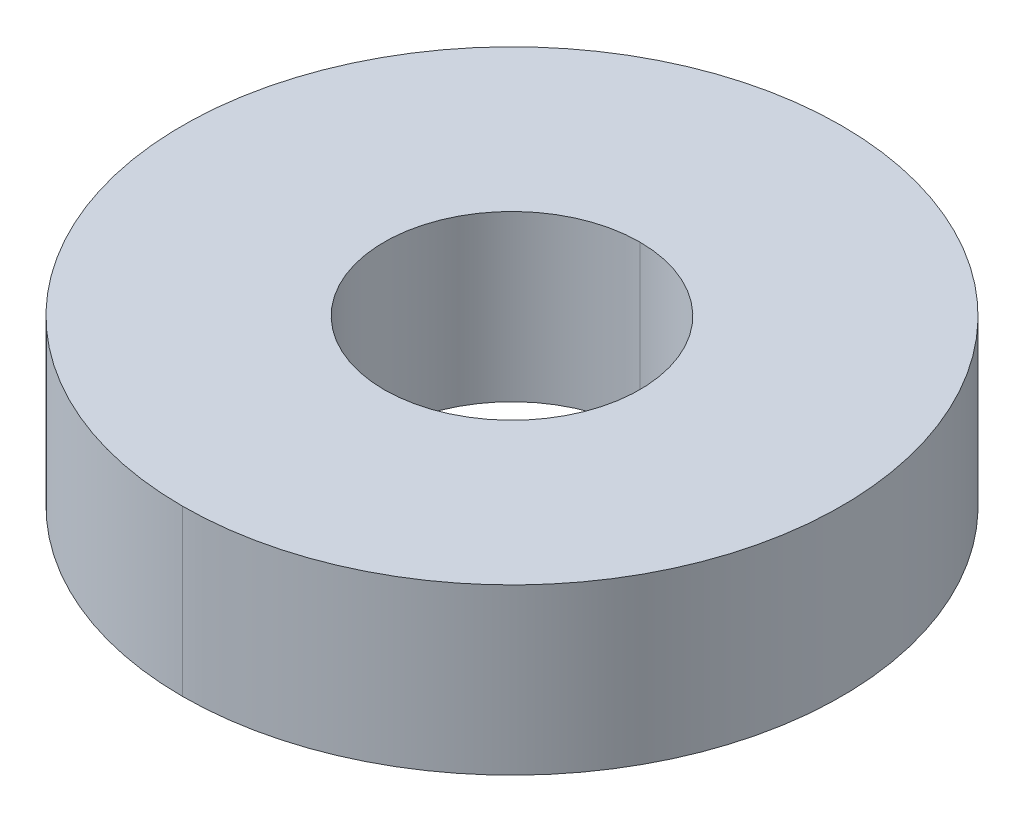
ISO-10303-21;
HEADER;
FILE_DESCRIPTION(('STEP AP214'),'2;1');
FILE_NAME('part.step','',(''),(''),'','','');
FILE_SCHEMA(('AUTOMOTIVE_DESIGN { 1 0 10303 214 1 1 1 1 }'));
ENDSEC;
DATA;
#1=APPLICATION_CONTEXT('core data for automotive mechanical design processes');
#2=APPLICATION_PROTOCOL_DEFINITION('international standard','automotive_design',2000,#1);
#3=PRODUCT_CONTEXT('',#1,'mechanical');
#4=PRODUCT('Part','Part','',(#3));
#5=PRODUCT_RELATED_PRODUCT_CATEGORY('part','',(#4));
#6=PRODUCT_DEFINITION_FORMATION('','',#4);
#7=PRODUCT_DEFINITION_CONTEXT('part definition',#1,'design');
#8=PRODUCT_DEFINITION('design','',#6,#7);
#9=PRODUCT_DEFINITION_SHAPE('','',#8);
#10=(LENGTH_UNIT() NAMED_UNIT(*) SI_UNIT(.MILLI.,.METRE.));
#11=(NAMED_UNIT(*) PLANE_ANGLE_UNIT() SI_UNIT($,.RADIAN.));
#12=(NAMED_UNIT(*) SI_UNIT($,.STERADIAN.) SOLID_ANGLE_UNIT());
#13=UNCERTAINTY_MEASURE_WITH_UNIT(LENGTH_MEASURE(1.E-05),#10,'distance_accuracy_value','');
#14=(GEOMETRIC_REPRESENTATION_CONTEXT(3) GLOBAL_UNCERTAINTY_ASSIGNED_CONTEXT((#13)) GLOBAL_UNIT_ASSIGNED_CONTEXT((#10,
#11,#12)) REPRESENTATION_CONTEXT('',''));
#15=CARTESIAN_POINT('',(0.,0.,0.));
#16=DIRECTION('',(0.,0.,1.));
#17=DIRECTION('',(1.,0.,0.));
#18=AXIS2_PLACEMENT_3D('',#15,#16,#17);
#19=CARTESIAN_POINT('',(0.,1.5875,0.));
#20=DIRECTION('',(0.,-1.,0.));
#21=DIRECTION('',(0.,0.,-1.));
#22=AXIS2_PLACEMENT_3D('',#19,#20,#21);
#23=CYLINDRICAL_SURFACE('',#22,2.4638);
#24=CARTESIAN_POINT('',(0.,1.5875,0.));
#25=DIRECTION('',(0.,1.,0.));
#26=DIRECTION('',(0.,0.,1.));
#27=AXIS2_PLACEMENT_3D('',#24,#25,#26);
#28=CIRCLE('',#27,2.4638);
#29=CARTESIAN_POINT('',(0.,1.5875,-2.4638));
#30=VERTEX_POINT('',#29);
#31=CARTESIAN_POINT('',(0.,1.5875,2.4638));
#32=VERTEX_POINT('',#31);
#33=EDGE_CURVE('E107',#30,#32,#28,.T.);
#34=ORIENTED_EDGE('',*,*,#33,.T.);
#35=DIRECTION('',(0.,-1.,0.));
#36=VECTOR('',#35,1.);
#37=CARTESIAN_POINT('',(0.,1.5875,2.4638));
#38=LINE('',#37,#36);
#39=CARTESIAN_POINT('',(0.,-1.5875,2.4638));
#40=VERTEX_POINT('',#39);
#41=EDGE_CURVE('E19',#32,#40,#38,.T.);
#42=ORIENTED_EDGE('',*,*,#41,.T.);
#43=CARTESIAN_POINT('',(0.,-1.5875,0.));
#44=DIRECTION('',(0.,1.,0.));
#45=DIRECTION('',(0.,0.,1.));
#46=AXIS2_PLACEMENT_3D('',#43,#44,#45);
#47=CIRCLE('',#46,2.4638);
#48=CARTESIAN_POINT('',(0.,-1.5875,-2.4638));
#49=VERTEX_POINT('',#48);
#50=EDGE_CURVE('E80',#49,#40,#47,.T.);
#51=ORIENTED_EDGE('',*,*,#50,.F.);
#52=DIRECTION('',(0.,-1.,0.));
#53=VECTOR('',#52,1.);
#54=CARTESIAN_POINT('',(0.,1.5875,-2.4638));
#55=LINE('',#54,#53);
#56=EDGE_CURVE('E11',#30,#49,#55,.T.);
#57=ORIENTED_EDGE('',*,*,#56,.F.);
#58=EDGE_LOOP('',(#34,#42,#51,#57));
#59=FACE_BOUND('',#58,.T.);
#60=ADVANCED_FACE('F16',(#59),#23,.F.);
#61=CARTESIAN_POINT('',(0.,1.5875,0.));
#62=DIRECTION('',(0.,-1.,0.));
#63=DIRECTION('',(0.,0.,-1.));
#64=AXIS2_PLACEMENT_3D('',#61,#62,#63);
#65=CYLINDRICAL_SURFACE('',#64,2.4638);
#66=ORIENTED_EDGE('',*,*,#41,.F.);
#67=CARTESIAN_POINT('',(0.,1.5875,0.));
#68=DIRECTION('',(0.,1.,0.));
#69=DIRECTION('',(0.,0.,1.));
#70=AXIS2_PLACEMENT_3D('',#67,#68,#69);
#71=CIRCLE('',#70,2.4638);
#72=EDGE_CURVE('E81',#32,#30,#71,.T.);
#73=ORIENTED_EDGE('',*,*,#72,.T.);
#74=ORIENTED_EDGE('',*,*,#56,.T.);
#75=CARTESIAN_POINT('',(0.,-1.5875,0.));
#76=DIRECTION('',(0.,1.,0.));
#77=DIRECTION('',(0.,0.,1.));
#78=AXIS2_PLACEMENT_3D('',#75,#76,#77);
#79=CIRCLE('',#78,2.4638);
#80=EDGE_CURVE('E100',#40,#49,#79,.T.);
#81=ORIENTED_EDGE('',*,*,#80,.F.);
#82=EDGE_LOOP('',(#66,#73,#74,#81));
#83=FACE_BOUND('',#82,.T.);
#84=ADVANCED_FACE('F119',(#83),#65,.F.);
#85=CARTESIAN_POINT('',(0.,-1.5875,0.));
#86=DIRECTION('',(0.,1.,0.));
#87=DIRECTION('',(1.,0.,0.));
#88=AXIS2_PLACEMENT_3D('',#85,#86,#87);
#89=PLANE('',#88);
#90=ORIENTED_EDGE('',*,*,#50,.T.);
#91=ORIENTED_EDGE('',*,*,#80,.T.);
#92=EDGE_LOOP('',(#90,#91));
#93=FACE_BOUND('',#92,.T.);
#94=CARTESIAN_POINT('',(0.,-1.5875,0.));
#95=DIRECTION('',(0.,1.,0.));
#96=DIRECTION('',(0.,0.,1.));
#97=AXIS2_PLACEMENT_3D('',#94,#95,#96);
#98=CIRCLE('',#97,6.35);
#99=CARTESIAN_POINT('',(0.,-1.5875,-6.35));
#100=VERTEX_POINT('',#99);
#101=CARTESIAN_POINT('',(0.,-1.5875,6.35));
#102=VERTEX_POINT('',#101);
#103=EDGE_CURVE('E83',#100,#102,#98,.T.);
#104=ORIENTED_EDGE('',*,*,#103,.F.);
#105=CARTESIAN_POINT('',(0.,-1.5875,0.));
#106=DIRECTION('',(0.,1.,0.));
#107=DIRECTION('',(0.,0.,1.));
#108=AXIS2_PLACEMENT_3D('',#105,#106,#107);
#109=CIRCLE('',#108,6.35);
#110=EDGE_CURVE('E69',#102,#100,#109,.T.);
#111=ORIENTED_EDGE('',*,*,#110,.F.);
#112=EDGE_LOOP('',(#104,#111));
#113=FACE_BOUND('',#112,.T.);
#114=ADVANCED_FACE('F84',(#93,#113),#89,.F.);
#115=CARTESIAN_POINT('',(0.,1.5875,0.));
#116=DIRECTION('',(0.,-1.,0.));
#117=DIRECTION('',(0.,0.,-1.));
#118=AXIS2_PLACEMENT_3D('',#115,#116,#117);
#119=CYLINDRICAL_SURFACE('',#118,6.35);
#120=CARTESIAN_POINT('',(0.,1.5875,0.));
#121=DIRECTION('',(0.,1.,0.));
#122=DIRECTION('',(0.,0.,1.));
#123=AXIS2_PLACEMENT_3D('',#120,#121,#122);
#124=CIRCLE('',#123,6.35);
#125=CARTESIAN_POINT('',(0.,1.5875,6.35));
#126=VERTEX_POINT('',#125);
#127=CARTESIAN_POINT('',(0.,1.5875,-6.35));
#128=VERTEX_POINT('',#127);
#129=EDGE_CURVE('E87',#126,#128,#124,.T.);
#130=ORIENTED_EDGE('',*,*,#129,.F.);
#131=DIRECTION('',(0.,-1.,0.));
#132=VECTOR('',#131,1.);
#133=CARTESIAN_POINT('',(0.,1.5875,6.35));
#134=LINE('',#133,#132);
#135=EDGE_CURVE('E76',#126,#102,#134,.T.);
#136=ORIENTED_EDGE('',*,*,#135,.T.);
#137=ORIENTED_EDGE('',*,*,#110,.T.);
#138=DIRECTION('',(0.,-1.,0.));
#139=VECTOR('',#138,1.);
#140=CARTESIAN_POINT('',(0.,1.5875,-6.35));
#141=LINE('',#140,#139);
#142=EDGE_CURVE('E73',#128,#100,#141,.T.);
#143=ORIENTED_EDGE('',*,*,#142,.F.);
#144=EDGE_LOOP('',(#130,#136,#137,#143));
#145=FACE_BOUND('',#144,.T.);
#146=ADVANCED_FACE('F71',(#145),#119,.T.);
#147=CARTESIAN_POINT('',(0.,1.5875,0.));
#148=DIRECTION('',(0.,1.,0.));
#149=DIRECTION('',(1.,0.,0.));
#150=AXIS2_PLACEMENT_3D('',#147,#148,#149);
#151=PLANE('',#150);
#152=ORIENTED_EDGE('',*,*,#33,.F.);
#153=ORIENTED_EDGE('',*,*,#72,.F.);
#154=EDGE_LOOP('',(#152,#153));
#155=FACE_BOUND('',#154,.T.);
#156=CARTESIAN_POINT('',(0.,1.5875,0.));
#157=DIRECTION('',(0.,1.,0.));
#158=DIRECTION('',(0.,0.,1.));
#159=AXIS2_PLACEMENT_3D('',#156,#157,#158);
#160=CIRCLE('',#159,6.35);
#161=EDGE_CURVE('E91',#128,#126,#160,.T.);
#162=ORIENTED_EDGE('',*,*,#161,.T.);
#163=ORIENTED_EDGE('',*,*,#129,.T.);
#164=EDGE_LOOP('',(#162,#163));
#165=FACE_BOUND('',#164,.T.);
#166=ADVANCED_FACE('F121',(#155,#165),#151,.T.);
#167=CARTESIAN_POINT('',(0.,1.5875,0.));
#168=DIRECTION('',(0.,-1.,0.));
#169=DIRECTION('',(0.,0.,-1.));
#170=AXIS2_PLACEMENT_3D('',#167,#168,#169);
#171=CYLINDRICAL_SURFACE('',#170,6.35);
#172=ORIENTED_EDGE('',*,*,#135,.F.);
#173=ORIENTED_EDGE('',*,*,#161,.F.);
#174=ORIENTED_EDGE('',*,*,#142,.T.);
#175=ORIENTED_EDGE('',*,*,#103,.T.);
#176=EDGE_LOOP('',(#172,#173,#174,#175));
#177=FACE_BOUND('',#176,.T.);
#178=ADVANCED_FACE('F89',(#177),#171,.T.);
#179=CLOSED_SHELL('',(#60,#84,#114,#146,#166,#178));
#180=MANIFOLD_SOLID_BREP('B1',#179);
#181=ADVANCED_BREP_SHAPE_REPRESENTATION('',(#18,#180),#14);
#182=SHAPE_DEFINITION_REPRESENTATION(#9,#181);
ENDSEC;
END-ISO-10303-21;
